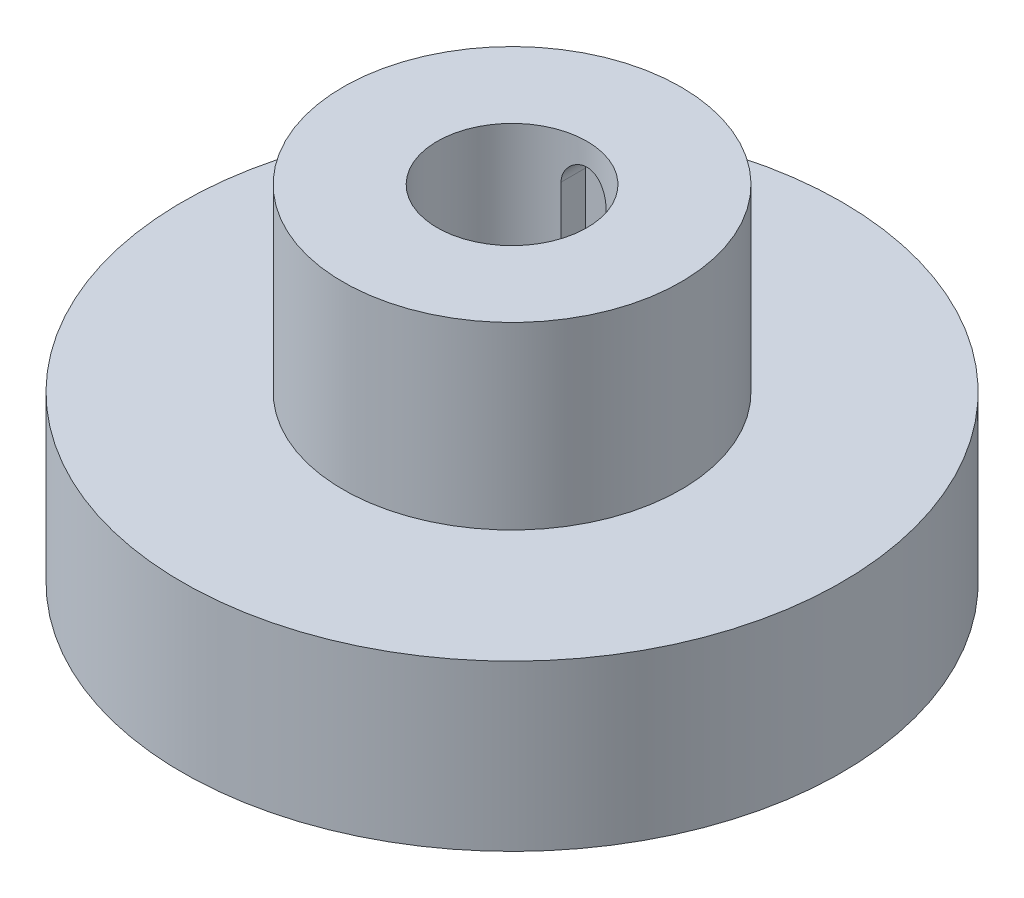
ISO-10303-21;
HEADER;
FILE_DESCRIPTION(('STEP AP214'),'2;1');
FILE_NAME('part.step','',(''),(''),'','','');
FILE_SCHEMA(('AUTOMOTIVE_DESIGN { 1 0 10303 214 1 1 1 1 }'));
ENDSEC;
DATA;
#1=APPLICATION_CONTEXT('core data for automotive mechanical design processes');
#2=APPLICATION_PROTOCOL_DEFINITION('international standard','automotive_design',2000,#1);
#3=PRODUCT_CONTEXT('',#1,'mechanical');
#4=PRODUCT('Part','Part','',(#3));
#5=PRODUCT_RELATED_PRODUCT_CATEGORY('part','',(#4));
#6=PRODUCT_DEFINITION_FORMATION('','',#4);
#7=PRODUCT_DEFINITION_CONTEXT('part definition',#1,'design');
#8=PRODUCT_DEFINITION('design','',#6,#7);
#9=PRODUCT_DEFINITION_SHAPE('','',#8);
#10=(LENGTH_UNIT() NAMED_UNIT(*) SI_UNIT(.MILLI.,.METRE.));
#11=(NAMED_UNIT(*) PLANE_ANGLE_UNIT() SI_UNIT($,.RADIAN.));
#12=(NAMED_UNIT(*) SI_UNIT($,.STERADIAN.) SOLID_ANGLE_UNIT());
#13=UNCERTAINTY_MEASURE_WITH_UNIT(LENGTH_MEASURE(1.E-05),#10,'distance_accuracy_value','');
#14=(GEOMETRIC_REPRESENTATION_CONTEXT(3) GLOBAL_UNCERTAINTY_ASSIGNED_CONTEXT((#13)) GLOBAL_UNIT_ASSIGNED_CONTEXT((#10,
#11,#12)) REPRESENTATION_CONTEXT('',''));
#15=CARTESIAN_POINT('',(0.,0.,0.));
#16=DIRECTION('',(0.,0.,1.));
#17=DIRECTION('',(1.,0.,0.));
#18=AXIS2_PLACEMENT_3D('',#15,#16,#17);
#19=CARTESIAN_POINT('',(11.2792851798845,23.,0.));
#20=DIRECTION('',(0.,1.,0.));
#21=DIRECTION('',(0.,0.,1.));
#22=AXIS2_PLACEMENT_3D('',#19,#20,#21);
#23=PLANE('',#22);
#24=CARTESIAN_POINT('',(0.,23.,0.));
#25=DIRECTION('',(0.,-1.,0.));
#26=DIRECTION('',(0.,0.,-1.));
#27=AXIS2_PLACEMENT_3D('',#24,#25,#26);
#28=CIRCLE('',#27,5.);
#29=CARTESIAN_POINT('',(0.,23.,-5.));
#30=VERTEX_POINT('',#29);
#31=EDGE_CURVE('E135',#30,#30,#28,.T.);
#32=ORIENTED_EDGE('',*,*,#31,.T.);
#33=EDGE_LOOP('',(#32));
#34=FACE_BOUND('',#33,.T.);
#35=CARTESIAN_POINT('',(0.,23.,0.));
#36=DIRECTION('',(0.,-1.,0.));
#37=DIRECTION('',(0.,0.,-1.));
#38=AXIS2_PLACEMENT_3D('',#35,#36,#37);
#39=CIRCLE('',#38,11.2792851798845);
#40=CARTESIAN_POINT('',(0.,23.,-11.2792851798845));
#41=VERTEX_POINT('',#40);
#42=EDGE_CURVE('E110',#41,#41,#39,.T.);
#43=ORIENTED_EDGE('',*,*,#42,.F.);
#44=EDGE_LOOP('',(#43));
#45=FACE_BOUND('',#44,.T.);
#46=ADVANCED_FACE('F39',(#34,#45),#23,.T.);
#47=CARTESIAN_POINT('',(0.,0.,0.));
#48=DIRECTION('',(0.,-1.,0.));
#49=DIRECTION('',(0.,0.,-1.));
#50=AXIS2_PLACEMENT_3D('',#47,#48,#49);
#51=CYLINDRICAL_SURFACE('',#50,5.);
#52=DIRECTION('',(0.,-1.,0.));
#53=VECTOR('',#52,1.);
#54=CARTESIAN_POINT('',(1.5,0.,-4.76969600708473));
#55=LINE('',#54,#53);
#56=CARTESIAN_POINT('',(1.5,5.,-4.76969600708473));
#57=VERTEX_POINT('',#56);
#58=CARTESIAN_POINT('',(1.5,20.,-4.76969600708473));
#59=VERTEX_POINT('',#58);
#60=EDGE_CURVE('E11',#57,#59,#55,.F.);
#61=ORIENTED_EDGE('',*,*,#60,.F.);
#62=CARTESIAN_POINT('',(-1.5,5.,-4.76969600708473));
#63=CARTESIAN_POINT('',(-1.50000085357071,4.95882060709199,-4.76969249084934));
#64=CARTESIAN_POINT('',(-1.49830317083428,4.91766195687388,-4.77022997000129));
#65=CARTESIAN_POINT('',(-1.49153785660317,4.83565883790444,-4.77235095109999));
#66=CARTESIAN_POINT('',(-1.48647098275841,4.79481430060511,-4.77393421787376));
#67=CARTESIAN_POINT('',(-1.46630203689311,4.67340945904534,-4.78018490618873));
#68=CARTESIAN_POINT('',(-1.44623120413662,4.59369360958363,-4.78635370384275));
#69=CARTESIAN_POINT('',(-1.39353102315626,4.43896442161414,-4.80195952113208));
#70=CARTESIAN_POINT('',(-1.36090607068203,4.36394944780192,-4.81139539670393));
#71=CARTESIAN_POINT('',(-1.28407841117655,4.2204033184024,-4.83246571212052));
#72=CARTESIAN_POINT('',(-1.23987031651226,4.15187520027156,-4.84410117434933));
#73=CARTESIAN_POINT('',(-1.13964850658326,4.02113394400295,-4.86866835244721));
#74=CARTESIAN_POINT('',(-1.08333433465208,3.9591563396566,-4.88162755412974));
#75=CARTESIAN_POINT('',(-0.961138919873354,3.84536441610004,-4.90714811559049));
#76=CARTESIAN_POINT('',(-0.895256063916347,3.79355181399695,-4.91970940785249));
#77=CARTESIAN_POINT('',(-0.754109921315429,3.70053622968151,-4.94333239727705));
#78=CARTESIAN_POINT('',(-0.678680819336259,3.65957481970205,-4.95435770971354));
#79=CARTESIAN_POINT('',(-0.521621185505774,3.59101158838185,-4.97334469846208));
#80=CARTESIAN_POINT('',(-0.439992259012927,3.56340632220572,-4.98130716463903));
#81=CARTESIAN_POINT('',(-0.275324697874878,3.52312020089795,-4.99307639935002));
#82=CARTESIAN_POINT('',(-0.192393125294253,3.51003514203026,-4.99699549276993));
#83=CARTESIAN_POINT('',(-0.0254235719980813,3.49788265863674,-5.00063202022426));
#84=CARTESIAN_POINT('',(0.058614196242363,3.49881258029984,-5.00035024971471));
#85=CARTESIAN_POINT('',(0.222571599946017,3.514392908759,-4.99569602566267));
#86=CARTESIAN_POINT('',(0.302537145464641,3.52860534497872,-4.99145415509187));
#87=CARTESIAN_POINT('',(0.458890052102026,3.56963163523811,-4.9795151369998));
#88=CARTESIAN_POINT('',(0.535277225531998,3.59644614945594,-4.97181780846028));
#89=CARTESIAN_POINT('',(0.683347815892216,3.66221222164644,-4.95365214926145));
#90=CARTESIAN_POINT('',(0.754966006044142,3.70130164435694,-4.94315255692525));
#91=CARTESIAN_POINT('',(0.89076552957442,3.79039859004832,-4.92049624651755));
#92=CARTESIAN_POINT('',(0.954945191614595,3.84040855947883,-4.90833915735884));
#93=CARTESIAN_POINT('',(1.07665450541275,3.95219198808351,-4.88311673571409));
#94=CARTESIAN_POINT('',(1.13383351478034,4.01434386376074,-4.87003445449554));
#95=CARTESIAN_POINT('',(1.23706769492487,4.14749742342792,-4.84484215114658));
#96=CARTESIAN_POINT('',(1.28311962013078,4.21850168036552,-4.83273241337565));
#97=CARTESIAN_POINT('',(1.36316407240863,4.36828092844929,-4.81077228795653));
#98=CARTESIAN_POINT('',(1.39703006341135,4.4471271795934,-4.80094596245948));
#99=CARTESIAN_POINT('',(1.45085886004699,4.60972450398174,-4.78495663653201));
#100=CARTESIAN_POINT('',(1.47084293218035,4.69346786071437,-4.77878803475875));
#101=CARTESIAN_POINT('',(1.4890120359008,4.81499488907019,-4.77314032325006));
#102=CARTESIAN_POINT('',(1.49313202989009,4.85189073417961,-4.77185156275267));
#103=CARTESIAN_POINT('',(1.49862355614854,4.92585147909953,-4.77012928611782));
#104=CARTESIAN_POINT('',(1.49999912968269,4.96291604966386,-4.76969451246644));
#105=CARTESIAN_POINT('',(1.5,5.,-4.76969600708473));
#106=B_SPLINE_CURVE_WITH_KNOTS('',3,(#62,#63,#64,#65,#66,#67,#68,#69,#70,#71,#72,#73,#74,#75,
#76,#77,#78,#79,#80,#81,#82,#83,#84,#85,#86,#87,#88,#89,#90,#91,#92,#93,#94,#95,#96,#97,#98,#99,
#100,#101,#102,#103,#104,#105),.UNSPECIFIED.,.F.,.F.,(4,2,2,2,2,2,2,2,2,2,2,2,2,2,2,2,2,2,2,2,2,
4),(0.,0.123459071219733,0.246890388853042,0.492911349615211,0.738846245884325,
0.984895736828093,1.23795510798803,1.49105719006936,1.74939356197455,2.00766326783256,
2.25854751319802,2.5093842528947,2.75223130012966,2.99509107067836,3.2407824256273,
3.48652887757005,3.74172568310981,3.99699683536777,4.25484698071527,4.51230123440207,
4.62365084745809,4.73483637253615),.UNSPECIFIED.);
#107=CARTESIAN_POINT('',(-1.5,5.,-4.76969600708473));
#108=VERTEX_POINT('',#107);
#109=EDGE_CURVE('E47',#108,#57,#106,.T.);
#110=ORIENTED_EDGE('',*,*,#109,.F.);
#111=DIRECTION('',(0.,-1.,0.));
#112=VECTOR('',#111,1.);
#113=CARTESIAN_POINT('',(-1.5,0.,-4.76969600708473));
#114=LINE('',#113,#112);
#115=CARTESIAN_POINT('',(-1.5,20.,-4.76969600708473));
#116=VERTEX_POINT('',#115);
#117=EDGE_CURVE('E147',#108,#116,#114,.F.);
#118=ORIENTED_EDGE('',*,*,#117,.T.);
#119=CARTESIAN_POINT('',(1.5,20.,-4.76969600708473));
#120=CARTESIAN_POINT('',(1.50000085357071,20.041179392908,-4.76969249084934));
#121=CARTESIAN_POINT('',(1.49830317083428,20.0823380431261,-4.77022997000129));
#122=CARTESIAN_POINT('',(1.49153785660317,20.1643411620956,-4.77235095109999));
#123=CARTESIAN_POINT('',(1.48647098275841,20.2051856993949,-4.77393421787376));
#124=CARTESIAN_POINT('',(1.46630203689311,20.3265905409547,-4.78018490618873));
#125=CARTESIAN_POINT('',(1.44623120413662,20.4063063904164,-4.78635370384275));
#126=CARTESIAN_POINT('',(1.39353102315626,20.5610355783859,-4.80195952113208));
#127=CARTESIAN_POINT('',(1.36090607068203,20.6360505521981,-4.81139539670393));
#128=CARTESIAN_POINT('',(1.28407841117655,20.7795966815976,-4.83246571212052));
#129=CARTESIAN_POINT('',(1.23987031651226,20.8481247997284,-4.84410117434933));
#130=CARTESIAN_POINT('',(1.13964850658326,20.9788660559971,-4.86866835244721));
#131=CARTESIAN_POINT('',(1.08333433465208,21.0408436603434,-4.88162755412974));
#132=CARTESIAN_POINT('',(0.961138919873351,21.1546355839,-4.90714811559049));
#133=CARTESIAN_POINT('',(0.895256063916344,21.2064481860031,-4.91970940785249));
#134=CARTESIAN_POINT('',(0.754109921315426,21.2994637703185,-4.94333239727705));
#135=CARTESIAN_POINT('',(0.678680819336255,21.340425180298,-4.95435770971354));
#136=CARTESIAN_POINT('',(0.521621185505772,21.4089884116182,-4.97334469846208));
#137=CARTESIAN_POINT('',(0.439992259012925,21.4365936777943,-4.98130716463903));
#138=CARTESIAN_POINT('',(0.275324697874877,21.4768797991021,-4.99307639935002));
#139=CARTESIAN_POINT('',(0.192393125294253,21.4899648579697,-4.99699549276993));
#140=CARTESIAN_POINT('',(0.0254235719980814,21.5021173413633,-5.00063202022426));
#141=CARTESIAN_POINT('',(-0.0586141962423628,21.5011874197002,-5.00035024971471));
#142=CARTESIAN_POINT('',(-0.222571599946017,21.485607091241,-4.99569602566267));
#143=CARTESIAN_POINT('',(-0.302537145464641,21.4713946550213,-4.99145415509187));
#144=CARTESIAN_POINT('',(-0.458890052102026,21.4303683647619,-4.9795151369998));
#145=CARTESIAN_POINT('',(-0.535277225531999,21.4035538505441,-4.97181780846028));
#146=CARTESIAN_POINT('',(-0.683347815892217,21.3377877783536,-4.95365214926145));
#147=CARTESIAN_POINT('',(-0.754966006044143,21.2986983556431,-4.94315255692525));
#148=CARTESIAN_POINT('',(-0.890765529574421,21.2096014099517,-4.92049624651755));
#149=CARTESIAN_POINT('',(-0.954945191614596,21.1595914405212,-4.90833915735884));
#150=CARTESIAN_POINT('',(-1.07665450541275,21.0478080119165,-4.88311673571409));
#151=CARTESIAN_POINT('',(-1.13383351478034,20.9856561362393,-4.87003445449554));
#152=CARTESIAN_POINT('',(-1.23706769492487,20.8525025765721,-4.84484215114658));
#153=CARTESIAN_POINT('',(-1.28311962013078,20.7814983196345,-4.83273241337565));
#154=CARTESIAN_POINT('',(-1.36316407240863,20.6317190715507,-4.81077228795653));
#155=CARTESIAN_POINT('',(-1.39703006341135,20.5528728204066,-4.80094596245948));
#156=CARTESIAN_POINT('',(-1.45085886004699,20.3902754960183,-4.78495663653201));
#157=CARTESIAN_POINT('',(-1.47084293218035,20.3065321392856,-4.77878803475875));
#158=CARTESIAN_POINT('',(-1.4890120359008,20.1850051109298,-4.77314032325006));
#159=CARTESIAN_POINT('',(-1.49313202989009,20.1481092658204,-4.77185156275267));
#160=CARTESIAN_POINT('',(-1.49862355614854,20.0741485209005,-4.77012928611782));
#161=CARTESIAN_POINT('',(-1.49999912968269,20.0370839503361,-4.76969451246644));
#162=CARTESIAN_POINT('',(-1.5,20.,-4.76969600708473));
#163=B_SPLINE_CURVE_WITH_KNOTS('',3,(#119,#120,#121,#122,#123,#124,#125,#126,#127,#128,#129,
#130,#131,#132,#133,#134,#135,#136,#137,#138,#139,#140,#141,#142,#143,#144,#145,#146,#147,#148,
#149,#150,#151,#152,#153,#154,#155,#156,#157,#158,#159,#160,#161,#162),.UNSPECIFIED.,.F.,.F.,(4,
2,2,2,2,2,2,2,2,2,2,2,2,2,2,2,2,2,2,2,2,4),(0.,0.123459071219737,0.246890388853047,
0.492911349615212,0.73884624588433,0.984895736828095,1.23795510798803,1.49105719006937,
1.74939356197455,2.00766326783256,2.25854751319802,2.5093842528947,2.75223130012966,
2.99509107067836,3.2407824256273,3.48652887757005,3.74172568310981,3.99699683536777,
4.25484698071527,4.51230123440207,4.62365084745809,4.73483637253616),.UNSPECIFIED.);
#164=EDGE_CURVE('E139',#59,#116,#163,.T.);
#165=ORIENTED_EDGE('',*,*,#164,.F.);
#166=EDGE_LOOP('',(#61,#110,#118,#165));
#167=FACE_BOUND('',#166,.T.);
#168=CARTESIAN_POINT('',(0.,0.,0.));
#169=DIRECTION('',(0.,-1.,0.));
#170=DIRECTION('',(0.,0.,-1.));
#171=AXIS2_PLACEMENT_3D('',#168,#169,#170);
#172=CIRCLE('',#171,5.);
#173=CARTESIAN_POINT('',(0.,0.,-5.));
#174=VERTEX_POINT('',#173);
#175=EDGE_CURVE('E131',#174,#174,#172,.T.);
#176=ORIENTED_EDGE('',*,*,#175,.T.);
#177=EDGE_LOOP('',(#176));
#178=FACE_BOUND('',#177,.T.);
#179=ORIENTED_EDGE('',*,*,#31,.F.);
#180=EDGE_LOOP('',(#179));
#181=FACE_BOUND('',#180,.T.);
#182=ADVANCED_FACE('F148',(#167,#178,#181),#51,.F.);
#183=CARTESIAN_POINT('',(5.,0.,0.));
#184=DIRECTION('',(0.,-1.,0.));
#185=DIRECTION('',(0.,0.,-1.));
#186=AXIS2_PLACEMENT_3D('',#183,#184,#185);
#187=PLANE('',#186);
#188=CARTESIAN_POINT('',(0.,0.,0.));
#189=DIRECTION('',(0.,-1.,0.));
#190=DIRECTION('',(0.,0.,-1.));
#191=AXIS2_PLACEMENT_3D('',#188,#189,#190);
#192=CIRCLE('',#191,22.);
#193=CARTESIAN_POINT('',(0.,0.,-22.));
#194=VERTEX_POINT('',#193);
#195=EDGE_CURVE('E127',#194,#194,#192,.T.);
#196=ORIENTED_EDGE('',*,*,#195,.T.);
#197=EDGE_LOOP('',(#196));
#198=FACE_BOUND('',#197,.T.);
#199=ORIENTED_EDGE('',*,*,#175,.F.);
#200=EDGE_LOOP('',(#199));
#201=FACE_BOUND('',#200,.T.);
#202=ADVANCED_FACE('F170',(#198,#201),#187,.T.);
#203=CARTESIAN_POINT('',(0.,0.,0.));
#204=DIRECTION('',(0.,-1.,0.));
#205=DIRECTION('',(0.,0.,-1.));
#206=AXIS2_PLACEMENT_3D('',#203,#204,#205);
#207=CYLINDRICAL_SURFACE('',#206,22.);
#208=CARTESIAN_POINT('',(0.,11.,0.));
#209=DIRECTION('',(0.,-1.,0.));
#210=DIRECTION('',(0.,0.,-1.));
#211=AXIS2_PLACEMENT_3D('',#208,#209,#210);
#212=CIRCLE('',#211,22.);
#213=CARTESIAN_POINT('',(0.,11.,-22.));
#214=VERTEX_POINT('',#213);
#215=EDGE_CURVE('E123',#214,#214,#212,.T.);
#216=ORIENTED_EDGE('',*,*,#215,.T.);
#217=EDGE_LOOP('',(#216));
#218=FACE_BOUND('',#217,.T.);
#219=ORIENTED_EDGE('',*,*,#195,.F.);
#220=EDGE_LOOP('',(#219));
#221=FACE_BOUND('',#220,.T.);
#222=ADVANCED_FACE('F167',(#218,#221),#207,.T.);
#223=CARTESIAN_POINT('',(22.,11.,0.));
#224=DIRECTION('',(0.,1.,0.));
#225=DIRECTION('',(0.,0.,1.));
#226=AXIS2_PLACEMENT_3D('',#223,#224,#225);
#227=PLANE('',#226);
#228=CARTESIAN_POINT('',(0.,11.,0.));
#229=DIRECTION('',(0.,-1.,0.));
#230=DIRECTION('',(0.,0.,-1.));
#231=AXIS2_PLACEMENT_3D('',#228,#229,#230);
#232=CIRCLE('',#231,11.2792851798845);
#233=CARTESIAN_POINT('',(0.,11.,-11.2792851798845));
#234=VERTEX_POINT('',#233);
#235=EDGE_CURVE('E119',#234,#234,#232,.T.);
#236=ORIENTED_EDGE('',*,*,#235,.T.);
#237=EDGE_LOOP('',(#236));
#238=FACE_BOUND('',#237,.T.);
#239=ORIENTED_EDGE('',*,*,#215,.F.);
#240=EDGE_LOOP('',(#239));
#241=FACE_BOUND('',#240,.T.);
#242=ADVANCED_FACE('F163',(#238,#241),#227,.T.);
#243=CARTESIAN_POINT('',(0.,0.,0.));
#244=DIRECTION('',(0.,-1.,0.));
#245=DIRECTION('',(0.,0.,-1.));
#246=AXIS2_PLACEMENT_3D('',#243,#244,#245);
#247=CYLINDRICAL_SURFACE('',#246,11.2792851798845);
#248=ORIENTED_EDGE('',*,*,#42,.T.);
#249=EDGE_LOOP('',(#248));
#250=FACE_BOUND('',#249,.T.);
#251=ORIENTED_EDGE('',*,*,#235,.F.);
#252=EDGE_LOOP('',(#251));
#253=FACE_BOUND('',#252,.T.);
#254=ADVANCED_FACE('F160',(#250,#253),#247,.T.);
#255=CARTESIAN_POINT('',(1.5,5.,-6.4));
#256=DIRECTION('',(1.,0.,0.));
#257=DIRECTION('',(0.,0.,-1.));
#258=AXIS2_PLACEMENT_3D('',#255,#256,#257);
#259=PLANE('',#258);
#260=ORIENTED_EDGE('',*,*,#60,.T.);
#261=DIRECTION('',(0.,0.,1.));
#262=VECTOR('',#261,1.);
#263=CARTESIAN_POINT('',(1.5,20.,-6.4));
#264=LINE('',#263,#262);
#265=CARTESIAN_POINT('',(1.5,20.,-6.4));
#266=VERTEX_POINT('',#265);
#267=EDGE_CURVE('E54',#266,#59,#264,.T.);
#268=ORIENTED_EDGE('',*,*,#267,.F.);
#269=DIRECTION('',(0.,1.,0.));
#270=VECTOR('',#269,1.);
#271=CARTESIAN_POINT('',(1.5,5.,-6.4));
#272=LINE('',#271,#270);
#273=CARTESIAN_POINT('',(1.5,5.,-6.4));
#274=VERTEX_POINT('',#273);
#275=EDGE_CURVE('E80',#274,#266,#272,.T.);
#276=ORIENTED_EDGE('',*,*,#275,.F.);
#277=DIRECTION('',(0.,0.,1.));
#278=VECTOR('',#277,1.);
#279=CARTESIAN_POINT('',(1.5,5.,-6.4));
#280=LINE('',#279,#278);
#281=EDGE_CURVE('E107',#274,#57,#280,.T.);
#282=ORIENTED_EDGE('',*,*,#281,.T.);
#283=EDGE_LOOP('',(#260,#268,#276,#282));
#284=FACE_BOUND('',#283,.T.);
#285=ADVANCED_FACE('F78',(#284),#259,.F.);
#286=CARTESIAN_POINT('',(0.,5.,-6.4));
#287=DIRECTION('',(0.,0.,1.));
#288=DIRECTION('',(1.,0.,0.));
#289=AXIS2_PLACEMENT_3D('',#286,#287,#288);
#290=CYLINDRICAL_SURFACE('',#289,1.5);
#291=ORIENTED_EDGE('',*,*,#109,.T.);
#292=ORIENTED_EDGE('',*,*,#281,.F.);
#293=CARTESIAN_POINT('',(0.,5.,-6.4));
#294=DIRECTION('',(0.,0.,1.));
#295=DIRECTION('',(1.,0.,0.));
#296=AXIS2_PLACEMENT_3D('',#293,#294,#295);
#297=CIRCLE('',#296,1.5);
#298=CARTESIAN_POINT('',(-1.5,5.,-6.4));
#299=VERTEX_POINT('',#298);
#300=EDGE_CURVE('E86',#299,#274,#297,.T.);
#301=ORIENTED_EDGE('',*,*,#300,.F.);
#302=DIRECTION('',(0.,0.,1.));
#303=VECTOR('',#302,1.);
#304=CARTESIAN_POINT('',(-1.5,5.,-6.4));
#305=LINE('',#304,#303);
#306=EDGE_CURVE('E111',#299,#108,#305,.T.);
#307=ORIENTED_EDGE('',*,*,#306,.T.);
#308=EDGE_LOOP('',(#291,#292,#301,#307));
#309=FACE_BOUND('',#308,.T.);
#310=ADVANCED_FACE('F159',(#309),#290,.F.);
#311=CARTESIAN_POINT('',(-1.5,5.,-6.4));
#312=DIRECTION('',(1.,0.,0.));
#313=DIRECTION('',(0.,0.,-1.));
#314=AXIS2_PLACEMENT_3D('',#311,#312,#313);
#315=PLANE('',#314);
#316=ORIENTED_EDGE('',*,*,#306,.F.);
#317=DIRECTION('',(0.,1.,0.));
#318=VECTOR('',#317,1.);
#319=CARTESIAN_POINT('',(-1.5,5.,-6.4));
#320=LINE('',#319,#318);
#321=CARTESIAN_POINT('',(-1.5,20.,-6.4));
#322=VERTEX_POINT('',#321);
#323=EDGE_CURVE('E96',#299,#322,#320,.T.);
#324=ORIENTED_EDGE('',*,*,#323,.T.);
#325=DIRECTION('',(0.,0.,1.));
#326=VECTOR('',#325,1.);
#327=CARTESIAN_POINT('',(-1.5,20.,-6.4));
#328=LINE('',#327,#326);
#329=EDGE_CURVE('E85',#322,#116,#328,.T.);
#330=ORIENTED_EDGE('',*,*,#329,.T.);
#331=ORIENTED_EDGE('',*,*,#117,.F.);
#332=EDGE_LOOP('',(#316,#324,#330,#331));
#333=FACE_BOUND('',#332,.T.);
#334=ADVANCED_FACE('F155',(#333),#315,.T.);
#335=CARTESIAN_POINT('',(0.,20.,-6.4));
#336=DIRECTION('',(0.,0.,1.));
#337=DIRECTION('',(1.,0.,0.));
#338=AXIS2_PLACEMENT_3D('',#335,#336,#337);
#339=CYLINDRICAL_SURFACE('',#338,1.5);
#340=ORIENTED_EDGE('',*,*,#164,.T.);
#341=ORIENTED_EDGE('',*,*,#329,.F.);
#342=CARTESIAN_POINT('',(0.,20.,-6.4));
#343=DIRECTION('',(0.,0.,1.));
#344=DIRECTION('',(1.,0.,0.));
#345=AXIS2_PLACEMENT_3D('',#342,#343,#344);
#346=CIRCLE('',#345,1.5);
#347=EDGE_CURVE('E90',#266,#322,#346,.T.);
#348=ORIENTED_EDGE('',*,*,#347,.F.);
#349=ORIENTED_EDGE('',*,*,#267,.T.);
#350=EDGE_LOOP('',(#340,#341,#348,#349));
#351=FACE_BOUND('',#350,.T.);
#352=ADVANCED_FACE('F91',(#351),#339,.F.);
#353=CARTESIAN_POINT('',(0.,20.,-6.4));
#354=DIRECTION('',(0.,0.,1.));
#355=DIRECTION('',(1.,0.,0.));
#356=AXIS2_PLACEMENT_3D('',#353,#354,#355);
#357=PLANE('',#356);
#358=ORIENTED_EDGE('',*,*,#275,.T.);
#359=ORIENTED_EDGE('',*,*,#347,.T.);
#360=ORIENTED_EDGE('',*,*,#323,.F.);
#361=ORIENTED_EDGE('',*,*,#300,.T.);
#362=EDGE_LOOP('',(#358,#359,#360,#361));
#363=FACE_BOUND('',#362,.T.);
#364=ADVANCED_FACE('F98',(#363),#357,.T.);
#365=CLOSED_SHELL('',(#46,#182,#202,#222,#242,#254,#285,#310,#334,#352,#364));
#366=MANIFOLD_SOLID_BREP('B2',#365);
#367=ADVANCED_BREP_SHAPE_REPRESENTATION('',(#18,#366),#14);
#368=SHAPE_DEFINITION_REPRESENTATION(#9,#367);
ENDSEC;
END-ISO-10303-21;
